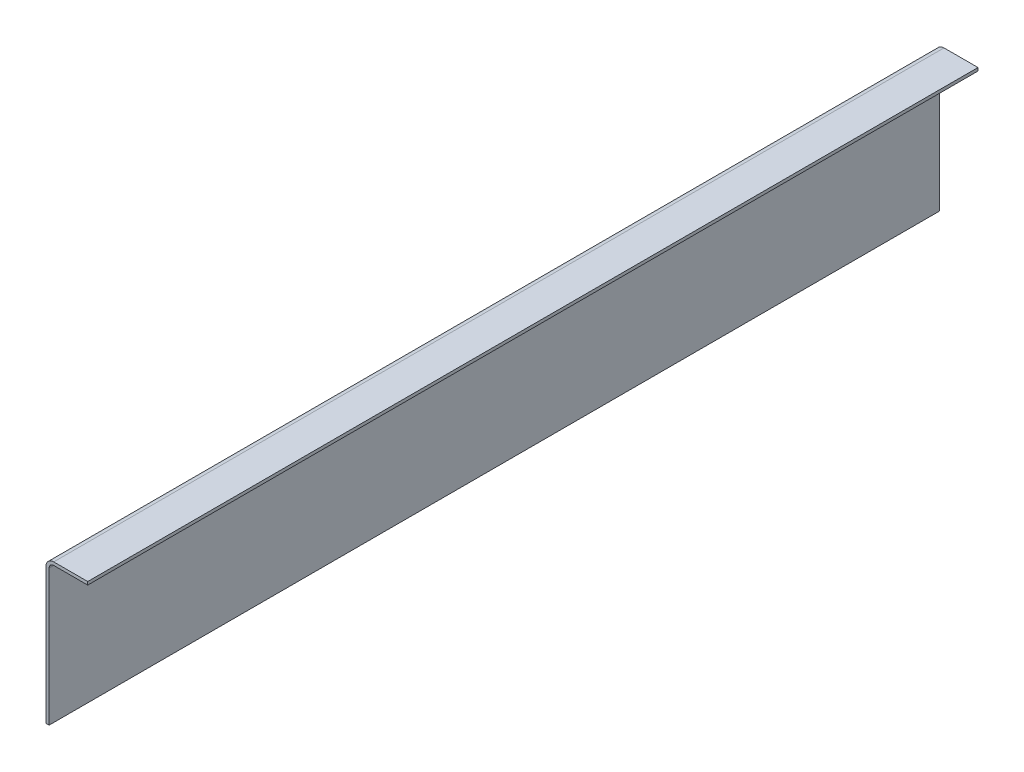
ISO-10303-21;
HEADER;
FILE_DESCRIPTION(('STEP AP214'),'2;1');
FILE_NAME('part.step','',(''),(''),'','','');
FILE_SCHEMA(('AUTOMOTIVE_DESIGN { 1 0 10303 214 1 1 1 1 }'));
ENDSEC;
DATA;
#1=APPLICATION_CONTEXT('core data for automotive mechanical design processes');
#2=APPLICATION_PROTOCOL_DEFINITION('international standard','automotive_design',2000,#1);
#3=PRODUCT_CONTEXT('',#1,'mechanical');
#4=PRODUCT('Part','Part','',(#3));
#5=PRODUCT_RELATED_PRODUCT_CATEGORY('part','',(#4));
#6=PRODUCT_DEFINITION_FORMATION('','',#4);
#7=PRODUCT_DEFINITION_CONTEXT('part definition',#1,'design');
#8=PRODUCT_DEFINITION('design','',#6,#7);
#9=PRODUCT_DEFINITION_SHAPE('','',#8);
#10=(LENGTH_UNIT() NAMED_UNIT(*) SI_UNIT(.MILLI.,.METRE.));
#11=(NAMED_UNIT(*) PLANE_ANGLE_UNIT() SI_UNIT($,.RADIAN.));
#12=(NAMED_UNIT(*) SI_UNIT($,.STERADIAN.) SOLID_ANGLE_UNIT());
#13=UNCERTAINTY_MEASURE_WITH_UNIT(LENGTH_MEASURE(1.E-05),#10,'distance_accuracy_value','');
#14=(GEOMETRIC_REPRESENTATION_CONTEXT(3) GLOBAL_UNCERTAINTY_ASSIGNED_CONTEXT((#13)) GLOBAL_UNIT_ASSIGNED_CONTEXT((#10,
#11,#12)) REPRESENTATION_CONTEXT('',''));
#15=CARTESIAN_POINT('',(0.,0.,0.));
#16=DIRECTION('',(0.,0.,1.));
#17=DIRECTION('',(1.,0.,0.));
#18=AXIS2_PLACEMENT_3D('',#15,#16,#17);
#19=CARTESIAN_POINT('',(-139.9585873412,34.708970181061,144.));
#20=DIRECTION('',(0.,0.,-1.));
#21=DIRECTION('',(0.,-1.,0.));
#22=AXIS2_PLACEMENT_3D('',#19,#20,#21);
#23=PLANE('',#22);
#24=DIRECTION('',(-1.,0.,0.));
#25=VECTOR('',#24,1.);
#26=CARTESIAN_POINT('',(-141.,7.,144.));
#27=LINE('',#26,#25);
#28=CARTESIAN_POINT('',(-141.,7.,144.));
#29=VERTEX_POINT('',#28);
#30=CARTESIAN_POINT('',(-142.,7.,144.));
#31=VERTEX_POINT('',#30);
#32=EDGE_CURVE('E28',#29,#31,#27,.T.);
#33=ORIENTED_EDGE('',*,*,#32,.F.);
#34=DIRECTION('',(0.,-1.,0.));
#35=VECTOR('',#34,1.);
#36=CARTESIAN_POINT('',(-141.,51.,144.));
#37=LINE('',#36,#35);
#38=CARTESIAN_POINT('',(-141.,51.,144.));
#39=VERTEX_POINT('',#38);
#40=EDGE_CURVE('E80',#39,#29,#37,.T.);
#41=ORIENTED_EDGE('',*,*,#40,.F.);
#42=CARTESIAN_POINT('',(-139.5,51.,144.));
#43=DIRECTION('',(0.,0.,1.));
#44=DIRECTION('',(0.,1.,0.));
#45=AXIS2_PLACEMENT_3D('',#42,#43,#44);
#46=CIRCLE('',#45,1.5);
#47=CARTESIAN_POINT('',(-139.5,52.5,144.));
#48=VERTEX_POINT('',#47);
#49=EDGE_CURVE('E143',#48,#39,#46,.T.);
#50=ORIENTED_EDGE('',*,*,#49,.F.);
#51=DIRECTION('',(-1.,0.,0.));
#52=VECTOR('',#51,1.);
#53=CARTESIAN_POINT('',(-128.5,52.5,144.));
#54=LINE('',#53,#52);
#55=CARTESIAN_POINT('',(-128.5,52.5,144.));
#56=VERTEX_POINT('',#55);
#57=EDGE_CURVE('E145',#56,#48,#54,.T.);
#58=ORIENTED_EDGE('',*,*,#57,.F.);
#59=DIRECTION('',(0.,-1.,0.));
#60=VECTOR('',#59,1.);
#61=CARTESIAN_POINT('',(-128.5,53.5,144.));
#62=LINE('',#61,#60);
#63=CARTESIAN_POINT('',(-128.5,53.5,144.));
#64=VERTEX_POINT('',#63);
#65=EDGE_CURVE('E113',#64,#56,#62,.T.);
#66=ORIENTED_EDGE('',*,*,#65,.F.);
#67=DIRECTION('',(1.,0.,0.));
#68=VECTOR('',#67,1.);
#69=CARTESIAN_POINT('',(-139.5,53.5,144.));
#70=LINE('',#69,#68);
#71=CARTESIAN_POINT('',(-139.5,53.5,144.));
#72=VERTEX_POINT('',#71);
#73=EDGE_CURVE('E95',#72,#64,#70,.T.);
#74=ORIENTED_EDGE('',*,*,#73,.F.);
#75=CARTESIAN_POINT('',(-139.5,51.,144.));
#76=DIRECTION('',(0.,0.,-1.));
#77=DIRECTION('',(-1.,0.,0.));
#78=AXIS2_PLACEMENT_3D('',#75,#76,#77);
#79=CIRCLE('',#78,2.5);
#80=CARTESIAN_POINT('',(-142.,51.,144.));
#81=VERTEX_POINT('',#80);
#82=EDGE_CURVE('E125',#81,#72,#79,.T.);
#83=ORIENTED_EDGE('',*,*,#82,.F.);
#84=DIRECTION('',(0.,1.,0.));
#85=VECTOR('',#84,1.);
#86=CARTESIAN_POINT('',(-142.,7.,144.));
#87=LINE('',#86,#85);
#88=EDGE_CURVE('E192',#31,#81,#87,.T.);
#89=ORIENTED_EDGE('',*,*,#88,.F.);
#90=EDGE_LOOP('',(#33,#41,#50,#58,#66,#74,#83,#89));
#91=FACE_BOUND('',#90,.T.);
#92=ADVANCED_FACE('F17',(#91),#23,.F.);
#93=CARTESIAN_POINT('',(-139.9585873412,34.708970181061,-144.));
#94=DIRECTION('',(0.,0.,-1.));
#95=DIRECTION('',(0.,-1.,0.));
#96=AXIS2_PLACEMENT_3D('',#93,#94,#95);
#97=PLANE('',#96);
#98=DIRECTION('',(0.,1.,0.));
#99=VECTOR('',#98,1.);
#100=CARTESIAN_POINT('',(-142.,7.,-144.));
#101=LINE('',#100,#99);
#102=CARTESIAN_POINT('',(-142.,7.,-144.));
#103=VERTEX_POINT('',#102);
#104=CARTESIAN_POINT('',(-142.,51.,-144.));
#105=VERTEX_POINT('',#104);
#106=EDGE_CURVE('E118',#103,#105,#101,.T.);
#107=ORIENTED_EDGE('',*,*,#106,.T.);
#108=CARTESIAN_POINT('',(-139.5,51.,-144.));
#109=DIRECTION('',(0.,0.,-1.));
#110=DIRECTION('',(-1.,0.,0.));
#111=AXIS2_PLACEMENT_3D('',#108,#109,#110);
#112=CIRCLE('',#111,2.5);
#113=CARTESIAN_POINT('',(-139.5,53.5,-144.));
#114=VERTEX_POINT('',#113);
#115=EDGE_CURVE('E116',#105,#114,#112,.T.);
#116=ORIENTED_EDGE('',*,*,#115,.T.);
#117=DIRECTION('',(1.,0.,0.));
#118=VECTOR('',#117,1.);
#119=CARTESIAN_POINT('',(-139.5,53.5,-144.));
#120=LINE('',#119,#118);
#121=CARTESIAN_POINT('',(-128.5,53.5,-144.));
#122=VERTEX_POINT('',#121);
#123=EDGE_CURVE('E102',#114,#122,#120,.T.);
#124=ORIENTED_EDGE('',*,*,#123,.T.);
#125=DIRECTION('',(0.,-1.,0.));
#126=VECTOR('',#125,1.);
#127=CARTESIAN_POINT('',(-128.5,53.5,-144.));
#128=LINE('',#127,#126);
#129=CARTESIAN_POINT('',(-128.5,52.5,-144.));
#130=VERTEX_POINT('',#129);
#131=EDGE_CURVE('E133',#122,#130,#128,.T.);
#132=ORIENTED_EDGE('',*,*,#131,.T.);
#133=DIRECTION('',(-1.,0.,0.));
#134=VECTOR('',#133,1.);
#135=CARTESIAN_POINT('',(-128.5,52.5,-144.));
#136=LINE('',#135,#134);
#137=CARTESIAN_POINT('',(-139.5,52.5,-144.));
#138=VERTEX_POINT('',#137);
#139=EDGE_CURVE('E140',#130,#138,#136,.T.);
#140=ORIENTED_EDGE('',*,*,#139,.T.);
#141=CARTESIAN_POINT('',(-139.5,51.,-144.));
#142=DIRECTION('',(0.,0.,1.));
#143=DIRECTION('',(0.,1.,0.));
#144=AXIS2_PLACEMENT_3D('',#141,#142,#143);
#145=CIRCLE('',#144,1.5);
#146=CARTESIAN_POINT('',(-141.,51.,-144.));
#147=VERTEX_POINT('',#146);
#148=EDGE_CURVE('E70',#138,#147,#145,.T.);
#149=ORIENTED_EDGE('',*,*,#148,.T.);
#150=DIRECTION('',(0.,-1.,0.));
#151=VECTOR('',#150,1.);
#152=CARTESIAN_POINT('',(-141.,51.,-144.));
#153=LINE('',#152,#151);
#154=CARTESIAN_POINT('',(-141.,7.,-144.));
#155=VERTEX_POINT('',#154);
#156=EDGE_CURVE('E21',#147,#155,#153,.T.);
#157=ORIENTED_EDGE('',*,*,#156,.T.);
#158=DIRECTION('',(-1.,0.,0.));
#159=VECTOR('',#158,1.);
#160=CARTESIAN_POINT('',(-141.,7.,-144.));
#161=LINE('',#160,#159);
#162=EDGE_CURVE('E11',#155,#103,#161,.T.);
#163=ORIENTED_EDGE('',*,*,#162,.T.);
#164=EDGE_LOOP('',(#107,#116,#124,#132,#140,#149,#157,#163));
#165=FACE_BOUND('',#164,.T.);
#166=ADVANCED_FACE('F19',(#165),#97,.T.);
#167=CARTESIAN_POINT('',(-141.,7.,-144.));
#168=DIRECTION('',(0.,-1.,0.));
#169=DIRECTION('',(0.,0.,-1.));
#170=AXIS2_PLACEMENT_3D('',#167,#168,#169);
#171=PLANE('',#170);
#172=DIRECTION('',(0.,0.,1.));
#173=VECTOR('',#172,1.);
#174=CARTESIAN_POINT('',(-141.,7.,-144.));
#175=LINE('',#174,#173);
#176=EDGE_CURVE('E167',#155,#29,#175,.T.);
#177=ORIENTED_EDGE('',*,*,#176,.T.);
#178=ORIENTED_EDGE('',*,*,#32,.T.);
#179=DIRECTION('',(0.,0.,1.));
#180=VECTOR('',#179,1.);
#181=CARTESIAN_POINT('',(-142.,7.,-144.));
#182=LINE('',#181,#180);
#183=EDGE_CURVE('E196',#103,#31,#182,.T.);
#184=ORIENTED_EDGE('',*,*,#183,.F.);
#185=ORIENTED_EDGE('',*,*,#162,.F.);
#186=EDGE_LOOP('',(#177,#178,#184,#185));
#187=FACE_BOUND('',#186,.T.);
#188=ADVANCED_FACE('F226',(#187),#171,.T.);
#189=CARTESIAN_POINT('',(-141.,51.,-144.));
#190=DIRECTION('',(1.,0.,0.));
#191=DIRECTION('',(0.,1.,0.));
#192=AXIS2_PLACEMENT_3D('',#189,#190,#191);
#193=PLANE('',#192);
#194=DIRECTION('',(0.,0.,1.));
#195=VECTOR('',#194,1.);
#196=CARTESIAN_POINT('',(-141.,51.,-144.));
#197=LINE('',#196,#195);
#198=EDGE_CURVE('E160',#147,#39,#197,.T.);
#199=ORIENTED_EDGE('',*,*,#198,.T.);
#200=ORIENTED_EDGE('',*,*,#40,.T.);
#201=ORIENTED_EDGE('',*,*,#176,.F.);
#202=ORIENTED_EDGE('',*,*,#156,.F.);
#203=EDGE_LOOP('',(#199,#200,#201,#202));
#204=FACE_BOUND('',#203,.T.);
#205=ADVANCED_FACE('F176',(#204),#193,.T.);
#206=CARTESIAN_POINT('',(-139.5,51.,-144.));
#207=DIRECTION('',(0.,0.,-1.));
#208=DIRECTION('',(0.,1.,0.));
#209=AXIS2_PLACEMENT_3D('',#206,#207,#208);
#210=CYLINDRICAL_SURFACE('',#209,1.5);
#211=DIRECTION('',(0.,0.,1.));
#212=VECTOR('',#211,1.);
#213=CARTESIAN_POINT('',(-139.5,52.5,-144.));
#214=LINE('',#213,#212);
#215=EDGE_CURVE('E144',#138,#48,#214,.T.);
#216=ORIENTED_EDGE('',*,*,#215,.T.);
#217=ORIENTED_EDGE('',*,*,#49,.T.);
#218=ORIENTED_EDGE('',*,*,#198,.F.);
#219=ORIENTED_EDGE('',*,*,#148,.F.);
#220=EDGE_LOOP('',(#216,#217,#218,#219));
#221=FACE_BOUND('',#220,.T.);
#222=ADVANCED_FACE('F177',(#221),#210,.F.);
#223=CARTESIAN_POINT('',(-128.5,52.5,-144.));
#224=DIRECTION('',(0.,-1.,0.));
#225=DIRECTION('',(0.,0.,-1.));
#226=AXIS2_PLACEMENT_3D('',#223,#224,#225);
#227=PLANE('',#226);
#228=DIRECTION('',(0.,0.,1.));
#229=VECTOR('',#228,1.);
#230=CARTESIAN_POINT('',(-128.5,52.5,-144.));
#231=LINE('',#230,#229);
#232=EDGE_CURVE('E151',#130,#56,#231,.T.);
#233=ORIENTED_EDGE('',*,*,#232,.T.);
#234=ORIENTED_EDGE('',*,*,#57,.T.);
#235=ORIENTED_EDGE('',*,*,#215,.F.);
#236=ORIENTED_EDGE('',*,*,#139,.F.);
#237=EDGE_LOOP('',(#233,#234,#235,#236));
#238=FACE_BOUND('',#237,.T.);
#239=ADVANCED_FACE('F183',(#238),#227,.T.);
#240=CARTESIAN_POINT('',(-128.5,53.5,-144.));
#241=DIRECTION('',(1.,0.,0.));
#242=DIRECTION('',(0.,1.,0.));
#243=AXIS2_PLACEMENT_3D('',#240,#241,#242);
#244=PLANE('',#243);
#245=DIRECTION('',(0.,0.,1.));
#246=VECTOR('',#245,1.);
#247=CARTESIAN_POINT('',(-128.5,53.5,-144.));
#248=LINE('',#247,#246);
#249=EDGE_CURVE('E109',#122,#64,#248,.T.);
#250=ORIENTED_EDGE('',*,*,#249,.T.);
#251=ORIENTED_EDGE('',*,*,#65,.T.);
#252=ORIENTED_EDGE('',*,*,#232,.F.);
#253=ORIENTED_EDGE('',*,*,#131,.F.);
#254=EDGE_LOOP('',(#250,#251,#252,#253));
#255=FACE_BOUND('',#254,.T.);
#256=ADVANCED_FACE('F186',(#255),#244,.T.);
#257=CARTESIAN_POINT('',(-139.5,53.5,-144.));
#258=DIRECTION('',(0.,1.,0.));
#259=DIRECTION('',(1.,0.,0.));
#260=AXIS2_PLACEMENT_3D('',#257,#258,#259);
#261=PLANE('',#260);
#262=DIRECTION('',(0.,0.,1.));
#263=VECTOR('',#262,1.);
#264=CARTESIAN_POINT('',(-139.5,53.5,-144.));
#265=LINE('',#264,#263);
#266=EDGE_CURVE('E106',#114,#72,#265,.T.);
#267=ORIENTED_EDGE('',*,*,#266,.T.);
#268=ORIENTED_EDGE('',*,*,#73,.T.);
#269=ORIENTED_EDGE('',*,*,#249,.F.);
#270=ORIENTED_EDGE('',*,*,#123,.F.);
#271=EDGE_LOOP('',(#267,#268,#269,#270));
#272=FACE_BOUND('',#271,.T.);
#273=ADVANCED_FACE('F104',(#272),#261,.T.);
#274=CARTESIAN_POINT('',(-139.5,51.,-144.));
#275=DIRECTION('',(0.,0.,-1.));
#276=DIRECTION('',(-1.,0.,0.));
#277=AXIS2_PLACEMENT_3D('',#274,#275,#276);
#278=CYLINDRICAL_SURFACE('',#277,2.5);
#279=DIRECTION('',(0.,0.,1.));
#280=VECTOR('',#279,1.);
#281=CARTESIAN_POINT('',(-142.,51.,-144.));
#282=LINE('',#281,#280);
#283=EDGE_CURVE('E195',#105,#81,#282,.T.);
#284=ORIENTED_EDGE('',*,*,#283,.T.);
#285=ORIENTED_EDGE('',*,*,#82,.T.);
#286=ORIENTED_EDGE('',*,*,#266,.F.);
#287=ORIENTED_EDGE('',*,*,#115,.F.);
#288=EDGE_LOOP('',(#284,#285,#286,#287));
#289=FACE_BOUND('',#288,.T.);
#290=ADVANCED_FACE('F124',(#289),#278,.T.);
#291=CARTESIAN_POINT('',(-142.,7.,-144.));
#292=DIRECTION('',(-1.,0.,0.));
#293=DIRECTION('',(0.,0.,1.));
#294=AXIS2_PLACEMENT_3D('',#291,#292,#293);
#295=PLANE('',#294);
#296=ORIENTED_EDGE('',*,*,#183,.T.);
#297=ORIENTED_EDGE('',*,*,#88,.T.);
#298=ORIENTED_EDGE('',*,*,#283,.F.);
#299=ORIENTED_EDGE('',*,*,#106,.F.);
#300=EDGE_LOOP('',(#296,#297,#298,#299));
#301=FACE_BOUND('',#300,.T.);
#302=ADVANCED_FACE('F225',(#301),#295,.T.);
#303=CLOSED_SHELL('',(#92,#166,#188,#205,#222,#239,#256,#273,#290,#302));
#304=MANIFOLD_SOLID_BREP('B1',#303);
#305=ADVANCED_BREP_SHAPE_REPRESENTATION('',(#18,#304),#14);
#306=SHAPE_DEFINITION_REPRESENTATION(#9,#305);
ENDSEC;
END-ISO-10303-21;
